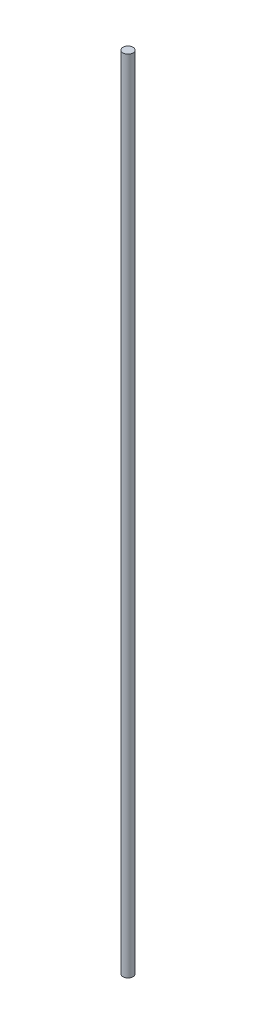
ISO-10303-21;
HEADER;
FILE_DESCRIPTION(('STEP AP214'),'2;1');
FILE_NAME('part.step','',(''),(''),'','','');
FILE_SCHEMA(('AUTOMOTIVE_DESIGN { 1 0 10303 214 1 1 1 1 }'));
ENDSEC;
DATA;
#1=APPLICATION_CONTEXT('core data for automotive mechanical design processes');
#2=APPLICATION_PROTOCOL_DEFINITION('international standard','automotive_design',2000,#1);
#3=PRODUCT_CONTEXT('',#1,'mechanical');
#4=PRODUCT('Part','Part','',(#3));
#5=PRODUCT_RELATED_PRODUCT_CATEGORY('part','',(#4));
#6=PRODUCT_DEFINITION_FORMATION('','',#4);
#7=PRODUCT_DEFINITION_CONTEXT('part definition',#1,'design');
#8=PRODUCT_DEFINITION('design','',#6,#7);
#9=PRODUCT_DEFINITION_SHAPE('','',#8);
#10=(LENGTH_UNIT() NAMED_UNIT(*) SI_UNIT(.MILLI.,.METRE.));
#11=(NAMED_UNIT(*) PLANE_ANGLE_UNIT() SI_UNIT($,.RADIAN.));
#12=(NAMED_UNIT(*) SI_UNIT($,.STERADIAN.) SOLID_ANGLE_UNIT());
#13=UNCERTAINTY_MEASURE_WITH_UNIT(LENGTH_MEASURE(1.E-05),#10,'distance_accuracy_value','');
#14=(GEOMETRIC_REPRESENTATION_CONTEXT(3) GLOBAL_UNCERTAINTY_ASSIGNED_CONTEXT((#13)) GLOBAL_UNIT_ASSIGNED_CONTEXT((#10,
#11,#12)) REPRESENTATION_CONTEXT('',''));
#15=CARTESIAN_POINT('',(0.,0.,0.));
#16=DIRECTION('',(0.,0.,1.));
#17=DIRECTION('',(1.,0.,0.));
#18=AXIS2_PLACEMENT_3D('',#15,#16,#17);
#19=CARTESIAN_POINT('',(0.,400.,0.));
#20=DIRECTION('',(0.,-1.,0.));
#21=DIRECTION('',(0.,0.,-1.));
#22=AXIS2_PLACEMENT_3D('',#19,#20,#21);
#23=CYLINDRICAL_SURFACE('',#22,2.5);
#24=CARTESIAN_POINT('',(0.,400.,0.));
#25=DIRECTION('',(0.,1.,0.));
#26=DIRECTION('',(0.,0.,1.));
#27=AXIS2_PLACEMENT_3D('',#24,#25,#26);
#28=CIRCLE('',#27,2.5);
#29=CARTESIAN_POINT('',(0.,400.,2.5));
#30=VERTEX_POINT('',#29);
#31=EDGE_CURVE('E10',#30,#30,#28,.T.);
#32=ORIENTED_EDGE('',*,*,#31,.F.);
#33=EDGE_LOOP('',(#32));
#34=FACE_BOUND('',#33,.T.);
#35=CARTESIAN_POINT('',(0.,0.,0.));
#36=DIRECTION('',(0.,1.,0.));
#37=DIRECTION('',(0.,0.,1.));
#38=AXIS2_PLACEMENT_3D('',#35,#36,#37);
#39=CIRCLE('',#38,2.5);
#40=CARTESIAN_POINT('',(0.,0.,2.5));
#41=VERTEX_POINT('',#40);
#42=EDGE_CURVE('E40',#41,#41,#39,.T.);
#43=ORIENTED_EDGE('',*,*,#42,.T.);
#44=EDGE_LOOP('',(#43));
#45=FACE_BOUND('',#44,.T.);
#46=ADVANCED_FACE('F37',(#34,#45),#23,.T.);
#47=CARTESIAN_POINT('',(0.,400.,0.));
#48=DIRECTION('',(0.,1.,0.));
#49=DIRECTION('',(0.,0.,1.));
#50=AXIS2_PLACEMENT_3D('',#47,#48,#49);
#51=PLANE('',#50);
#52=ORIENTED_EDGE('',*,*,#31,.T.);
#53=EDGE_LOOP('',(#52));
#54=FACE_BOUND('',#53,.T.);
#55=ADVANCED_FACE('F54',(#54),#51,.T.);
#56=CARTESIAN_POINT('',(0.,0.,0.));
#57=DIRECTION('',(0.,1.,0.));
#58=DIRECTION('',(0.,0.,1.));
#59=AXIS2_PLACEMENT_3D('',#56,#57,#58);
#60=PLANE('',#59);
#61=ORIENTED_EDGE('',*,*,#42,.F.);
#62=EDGE_LOOP('',(#61));
#63=FACE_BOUND('',#62,.T.);
#64=ADVANCED_FACE('F52',(#63),#60,.F.);
#65=CLOSED_SHELL('',(#46,#55,#64));
#66=MANIFOLD_SOLID_BREP('B2',#65);
#67=ADVANCED_BREP_SHAPE_REPRESENTATION('',(#18,#66),#14);
#68=SHAPE_DEFINITION_REPRESENTATION(#9,#67);
ENDSEC;
END-ISO-10303-21;
